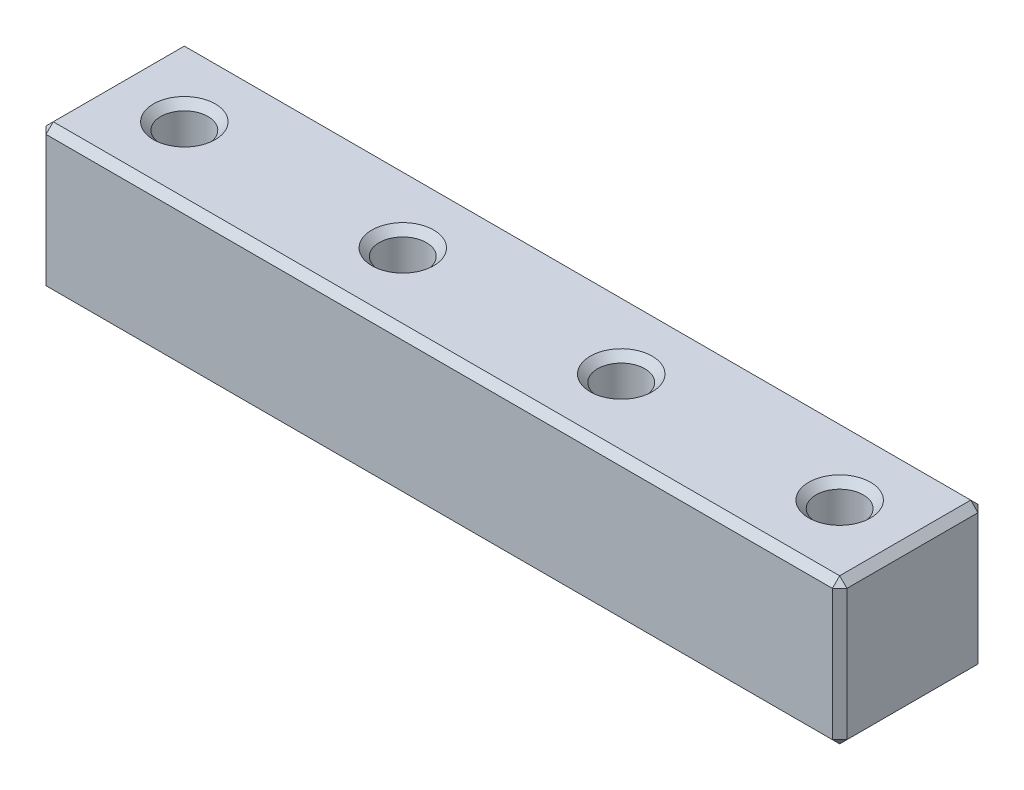
ISO-10303-21;
HEADER;
FILE_DESCRIPTION(('STEP AP214'),'2;1');
FILE_NAME('part.step','',(''),(''),'','','');
FILE_SCHEMA(('AUTOMOTIVE_DESIGN { 1 0 10303 214 1 1 1 1 }'));
ENDSEC;
DATA;
#1=APPLICATION_CONTEXT('core data for automotive mechanical design processes');
#2=APPLICATION_PROTOCOL_DEFINITION('international standard','automotive_design',2000,#1);
#3=PRODUCT_CONTEXT('',#1,'mechanical');
#4=PRODUCT('Part','Part','',(#3));
#5=PRODUCT_RELATED_PRODUCT_CATEGORY('part','',(#4));
#6=PRODUCT_DEFINITION_FORMATION('','',#4);
#7=PRODUCT_DEFINITION_CONTEXT('part definition',#1,'design');
#8=PRODUCT_DEFINITION('design','',#6,#7);
#9=PRODUCT_DEFINITION_SHAPE('','',#8);
#10=(LENGTH_UNIT() NAMED_UNIT(*) SI_UNIT(.MILLI.,.METRE.));
#11=(NAMED_UNIT(*) PLANE_ANGLE_UNIT() SI_UNIT($,.RADIAN.));
#12=(NAMED_UNIT(*) SI_UNIT($,.STERADIAN.) SOLID_ANGLE_UNIT());
#13=UNCERTAINTY_MEASURE_WITH_UNIT(LENGTH_MEASURE(1.E-05),#10,'distance_accuracy_value','');
#14=(GEOMETRIC_REPRESENTATION_CONTEXT(3) GLOBAL_UNCERTAINTY_ASSIGNED_CONTEXT((#13)) GLOBAL_UNIT_ASSIGNED_CONTEXT((#10,
#11,#12)) REPRESENTATION_CONTEXT('',''));
#15=CARTESIAN_POINT('',(0.,0.,0.));
#16=DIRECTION('',(0.,0.,1.));
#17=DIRECTION('',(1.,0.,0.));
#18=AXIS2_PLACEMENT_3D('',#15,#16,#17);
#19=CARTESIAN_POINT('',(0.,20.,0.));
#20=DIRECTION('',(0.,-1.,0.));
#21=DIRECTION('',(0.,0.,-1.));
#22=AXIS2_PLACEMENT_3D('',#19,#20,#21);
#23=PLANE('',#22);
#24=CARTESIAN_POINT('',(45.,20.,0.));
#25=DIRECTION('',(0.,-1.,0.));
#26=DIRECTION('',(0.,0.,-1.));
#27=AXIS2_PLACEMENT_3D('',#24,#25,#26);
#28=CIRCLE('',#27,4.25);
#29=CARTESIAN_POINT('',(45.,20.,-4.25000000000002));
#30=VERTEX_POINT('',#29);
#31=EDGE_CURVE('E206',#30,#30,#28,.T.);
#32=ORIENTED_EDGE('',*,*,#31,.T.);
#33=EDGE_LOOP('',(#32));
#34=FACE_BOUND('',#33,.T.);
#35=CARTESIAN_POINT('',(15.,20.,0.));
#36=DIRECTION('',(0.,-1.,0.));
#37=DIRECTION('',(0.,0.,-1.));
#38=AXIS2_PLACEMENT_3D('',#35,#36,#37);
#39=CIRCLE('',#38,4.25);
#40=CARTESIAN_POINT('',(15.,20.,-4.25000000000001));
#41=VERTEX_POINT('',#40);
#42=EDGE_CURVE('E203',#41,#41,#39,.T.);
#43=ORIENTED_EDGE('',*,*,#42,.T.);
#44=EDGE_LOOP('',(#43));
#45=FACE_BOUND('',#44,.T.);
#46=CARTESIAN_POINT('',(-15.,20.,0.));
#47=DIRECTION('',(0.,-1.,0.));
#48=DIRECTION('',(0.,0.,-1.));
#49=AXIS2_PLACEMENT_3D('',#46,#47,#48);
#50=CIRCLE('',#49,4.25);
#51=CARTESIAN_POINT('',(-15.,20.,-4.25));
#52=VERTEX_POINT('',#51);
#53=EDGE_CURVE('E200',#52,#52,#50,.T.);
#54=ORIENTED_EDGE('',*,*,#53,.T.);
#55=EDGE_LOOP('',(#54));
#56=FACE_BOUND('',#55,.T.);
#57=CARTESIAN_POINT('',(-45.,20.,0.));
#58=DIRECTION('',(0.,-1.,0.));
#59=DIRECTION('',(0.,0.,-1.));
#60=AXIS2_PLACEMENT_3D('',#57,#58,#59);
#61=CIRCLE('',#60,4.25);
#62=CARTESIAN_POINT('',(-45.,20.,-4.25));
#63=VERTEX_POINT('',#62);
#64=EDGE_CURVE('E197',#63,#63,#61,.T.);
#65=ORIENTED_EDGE('',*,*,#64,.T.);
#66=EDGE_LOOP('',(#65));
#67=FACE_BOUND('',#66,.T.);
#68=DIRECTION('',(1.,0.,0.));
#69=VECTOR('',#68,1.);
#70=CARTESIAN_POINT('',(0.,20.,9.));
#71=LINE('',#70,#69);
#72=CARTESIAN_POINT('',(-54.,20.,9.));
#73=VERTEX_POINT('',#72);
#74=CARTESIAN_POINT('',(54.,20.,9.));
#75=VERTEX_POINT('',#74);
#76=EDGE_CURVE('E188',#73,#75,#71,.T.);
#77=ORIENTED_EDGE('',*,*,#76,.T.);
#78=DIRECTION('',(0.,0.,-1.));
#79=VECTOR('',#78,1.);
#80=CARTESIAN_POINT('',(54.,20.,0.));
#81=LINE('',#80,#79);
#82=CARTESIAN_POINT('',(54.,20.,-9.));
#83=VERTEX_POINT('',#82);
#84=EDGE_CURVE('E194',#75,#83,#81,.T.);
#85=ORIENTED_EDGE('',*,*,#84,.T.);
#86=DIRECTION('',(-1.,0.,0.));
#87=VECTOR('',#86,1.);
#88=CARTESIAN_POINT('',(0.,20.,-9.));
#89=LINE('',#88,#87);
#90=CARTESIAN_POINT('',(-54.,20.,-9.));
#91=VERTEX_POINT('',#90);
#92=EDGE_CURVE('E192',#83,#91,#89,.T.);
#93=ORIENTED_EDGE('',*,*,#92,.T.);
#94=DIRECTION('',(0.,0.,1.));
#95=VECTOR('',#94,1.);
#96=CARTESIAN_POINT('',(-54.,20.,0.));
#97=LINE('',#96,#95);
#98=EDGE_CURVE('E190',#91,#73,#97,.T.);
#99=ORIENTED_EDGE('',*,*,#98,.T.);
#100=EDGE_LOOP('',(#77,#85,#93,#99));
#101=FACE_BOUND('',#100,.T.);
#102=ADVANCED_FACE('F43',(#34,#45,#56,#67,#101),#23,.F.);
#103=CARTESIAN_POINT('',(0.,0.,0.));
#104=DIRECTION('',(0.,-1.,0.));
#105=DIRECTION('',(0.,0.,-1.));
#106=AXIS2_PLACEMENT_3D('',#103,#104,#105);
#107=PLANE('',#106);
#108=CARTESIAN_POINT('',(45.,0.,0.));
#109=DIRECTION('',(0.,-1.,0.));
#110=DIRECTION('',(0.,0.,-1.));
#111=AXIS2_PLACEMENT_3D('',#108,#109,#110);
#112=CIRCLE('',#111,4.25);
#113=CARTESIAN_POINT('',(45.,0.,-4.25000000000002));
#114=VERTEX_POINT('',#113);
#115=EDGE_CURVE('E179',#114,#114,#112,.F.);
#116=ORIENTED_EDGE('',*,*,#115,.T.);
#117=EDGE_LOOP('',(#116));
#118=FACE_BOUND('',#117,.T.);
#119=CARTESIAN_POINT('',(15.,0.,0.));
#120=DIRECTION('',(0.,-1.,0.));
#121=DIRECTION('',(0.,0.,-1.));
#122=AXIS2_PLACEMENT_3D('',#119,#120,#121);
#123=CIRCLE('',#122,4.25);
#124=CARTESIAN_POINT('',(15.,0.,-4.25000000000001));
#125=VERTEX_POINT('',#124);
#126=EDGE_CURVE('E176',#125,#125,#123,.F.);
#127=ORIENTED_EDGE('',*,*,#126,.T.);
#128=EDGE_LOOP('',(#127));
#129=FACE_BOUND('',#128,.T.);
#130=CARTESIAN_POINT('',(-15.,0.,0.));
#131=DIRECTION('',(0.,-1.,0.));
#132=DIRECTION('',(0.,0.,-1.));
#133=AXIS2_PLACEMENT_3D('',#130,#131,#132);
#134=CIRCLE('',#133,4.25);
#135=CARTESIAN_POINT('',(-15.,0.,-4.25));
#136=VERTEX_POINT('',#135);
#137=EDGE_CURVE('E169',#136,#136,#134,.F.);
#138=ORIENTED_EDGE('',*,*,#137,.T.);
#139=EDGE_LOOP('',(#138));
#140=FACE_BOUND('',#139,.T.);
#141=CARTESIAN_POINT('',(-45.,0.,0.));
#142=DIRECTION('',(0.,-1.,0.));
#143=DIRECTION('',(0.,0.,-1.));
#144=AXIS2_PLACEMENT_3D('',#141,#142,#143);
#145=CIRCLE('',#144,4.25);
#146=CARTESIAN_POINT('',(-45.,0.,-4.25));
#147=VERTEX_POINT('',#146);
#148=EDGE_CURVE('E166',#147,#147,#145,.F.);
#149=ORIENTED_EDGE('',*,*,#148,.T.);
#150=EDGE_LOOP('',(#149));
#151=FACE_BOUND('',#150,.T.);
#152=DIRECTION('',(1.,0.,0.));
#153=VECTOR('',#152,1.);
#154=CARTESIAN_POINT('',(55.,0.,-9.));
#155=LINE('',#154,#153);
#156=CARTESIAN_POINT('',(-54.,0.,-9.));
#157=VERTEX_POINT('',#156);
#158=CARTESIAN_POINT('',(54.,0.,-9.));
#159=VERTEX_POINT('',#158);
#160=EDGE_CURVE('E165',#157,#159,#155,.T.);
#161=ORIENTED_EDGE('',*,*,#160,.T.);
#162=DIRECTION('',(0.,0.,1.));
#163=VECTOR('',#162,1.);
#164=CARTESIAN_POINT('',(54.,0.,10.));
#165=LINE('',#164,#163);
#166=CARTESIAN_POINT('',(54.,0.,9.));
#167=VERTEX_POINT('',#166);
#168=EDGE_CURVE('E149',#159,#167,#165,.T.);
#169=ORIENTED_EDGE('',*,*,#168,.T.);
#170=DIRECTION('',(-1.,0.,0.));
#171=VECTOR('',#170,1.);
#172=CARTESIAN_POINT('',(-55.,0.,9.));
#173=LINE('',#172,#171);
#174=CARTESIAN_POINT('',(-54.,0.,9.));
#175=VERTEX_POINT('',#174);
#176=EDGE_CURVE('E155',#167,#175,#173,.T.);
#177=ORIENTED_EDGE('',*,*,#176,.T.);
#178=DIRECTION('',(0.,0.,-1.));
#179=VECTOR('',#178,1.);
#180=CARTESIAN_POINT('',(-54.,0.,-10.));
#181=LINE('',#180,#179);
#182=EDGE_CURVE('E161',#175,#157,#181,.T.);
#183=ORIENTED_EDGE('',*,*,#182,.T.);
#184=EDGE_LOOP('',(#161,#169,#177,#183));
#185=FACE_BOUND('',#184,.T.);
#186=ADVANCED_FACE('F163',(#118,#129,#140,#151,#185),#107,.T.);
#187=CARTESIAN_POINT('',(55.,20.,10.));
#188=DIRECTION('',(-1.,0.,0.));
#189=DIRECTION('',(0.,0.,1.));
#190=AXIS2_PLACEMENT_3D('',#187,#188,#189);
#191=PLANE('',#190);
#192=DIRECTION('',(0.,0.,-1.));
#193=VECTOR('',#192,1.);
#194=CARTESIAN_POINT('',(55.,1.,-10.));
#195=LINE('',#194,#193);
#196=CARTESIAN_POINT('',(55.,1.,9.));
#197=VERTEX_POINT('',#196);
#198=CARTESIAN_POINT('',(55.,1.,-9.));
#199=VERTEX_POINT('',#198);
#200=EDGE_CURVE('E151',#197,#199,#195,.T.);
#201=ORIENTED_EDGE('',*,*,#200,.T.);
#202=DIRECTION('',(0.,1.,0.));
#203=VECTOR('',#202,1.);
#204=CARTESIAN_POINT('',(55.,20.,-9.));
#205=LINE('',#204,#203);
#206=CARTESIAN_POINT('',(55.,19.,-9.));
#207=VERTEX_POINT('',#206);
#208=EDGE_CURVE('E233',#199,#207,#205,.T.);
#209=ORIENTED_EDGE('',*,*,#208,.T.);
#210=DIRECTION('',(0.,0.,1.));
#211=VECTOR('',#210,1.);
#212=CARTESIAN_POINT('',(55.,19.,10.));
#213=LINE('',#212,#211);
#214=CARTESIAN_POINT('',(55.,19.,9.));
#215=VERTEX_POINT('',#214);
#216=EDGE_CURVE('E230',#207,#215,#213,.T.);
#217=ORIENTED_EDGE('',*,*,#216,.T.);
#218=DIRECTION('',(0.,-1.,0.));
#219=VECTOR('',#218,1.);
#220=CARTESIAN_POINT('',(55.,20.,9.));
#221=LINE('',#220,#219);
#222=EDGE_CURVE('E227',#215,#197,#221,.T.);
#223=ORIENTED_EDGE('',*,*,#222,.T.);
#224=EDGE_LOOP('',(#201,#209,#217,#223));
#225=FACE_BOUND('',#224,.T.);
#226=ADVANCED_FACE('F335',(#225),#191,.F.);
#227=CARTESIAN_POINT('',(-55.,20.,-10.));
#228=DIRECTION('',(0.,0.,1.));
#229=DIRECTION('',(1.,0.,0.));
#230=AXIS2_PLACEMENT_3D('',#227,#228,#229);
#231=PLANE('',#230);
#232=DIRECTION('',(1.,0.,0.));
#233=VECTOR('',#232,1.);
#234=CARTESIAN_POINT('',(-55.,19.,-10.));
#235=LINE('',#234,#233);
#236=CARTESIAN_POINT('',(-54.,19.,-10.));
#237=VERTEX_POINT('',#236);
#238=CARTESIAN_POINT('',(54.,19.,-10.));
#239=VERTEX_POINT('',#238);
#240=EDGE_CURVE('E239',#237,#239,#235,.T.);
#241=ORIENTED_EDGE('',*,*,#240,.T.);
#242=DIRECTION('',(0.,-1.,0.));
#243=VECTOR('',#242,1.);
#244=CARTESIAN_POINT('',(54.,20.,-10.));
#245=LINE('',#244,#243);
#246=CARTESIAN_POINT('',(54.,1.,-10.));
#247=VERTEX_POINT('',#246);
#248=EDGE_CURVE('E241',#239,#247,#245,.T.);
#249=ORIENTED_EDGE('',*,*,#248,.T.);
#250=DIRECTION('',(-1.,0.,0.));
#251=VECTOR('',#250,1.);
#252=CARTESIAN_POINT('',(-55.,1.,-10.));
#253=LINE('',#252,#251);
#254=CARTESIAN_POINT('',(-54.,1.,-10.));
#255=VERTEX_POINT('',#254);
#256=EDGE_CURVE('E237',#247,#255,#253,.T.);
#257=ORIENTED_EDGE('',*,*,#256,.T.);
#258=DIRECTION('',(0.,1.,0.));
#259=VECTOR('',#258,1.);
#260=CARTESIAN_POINT('',(-54.,20.,-10.));
#261=LINE('',#260,#259);
#262=EDGE_CURVE('E235',#255,#237,#261,.T.);
#263=ORIENTED_EDGE('',*,*,#262,.T.);
#264=EDGE_LOOP('',(#241,#249,#257,#263));
#265=FACE_BOUND('',#264,.T.);
#266=ADVANCED_FACE('F367',(#265),#231,.F.);
#267=CARTESIAN_POINT('',(-55.,20.,10.));
#268=DIRECTION('',(1.,0.,0.));
#269=DIRECTION('',(0.,0.,-1.));
#270=AXIS2_PLACEMENT_3D('',#267,#268,#269);
#271=PLANE('',#270);
#272=DIRECTION('',(0.,0.,-1.));
#273=VECTOR('',#272,1.);
#274=CARTESIAN_POINT('',(-55.,19.,10.));
#275=LINE('',#274,#273);
#276=CARTESIAN_POINT('',(-55.,19.,9.));
#277=VERTEX_POINT('',#276);
#278=CARTESIAN_POINT('',(-55.,19.,-9.));
#279=VERTEX_POINT('',#278);
#280=EDGE_CURVE('E248',#277,#279,#275,.T.);
#281=ORIENTED_EDGE('',*,*,#280,.T.);
#282=DIRECTION('',(0.,-1.,0.));
#283=VECTOR('',#282,1.);
#284=CARTESIAN_POINT('',(-55.,20.,-9.));
#285=LINE('',#284,#283);
#286=CARTESIAN_POINT('',(-55.,1.,-9.));
#287=VERTEX_POINT('',#286);
#288=EDGE_CURVE('E250',#279,#287,#285,.T.);
#289=ORIENTED_EDGE('',*,*,#288,.T.);
#290=DIRECTION('',(0.,0.,1.));
#291=VECTOR('',#290,1.);
#292=CARTESIAN_POINT('',(-55.,1.,10.));
#293=LINE('',#292,#291);
#294=CARTESIAN_POINT('',(-55.,1.,9.));
#295=VERTEX_POINT('',#294);
#296=EDGE_CURVE('E246',#287,#295,#293,.T.);
#297=ORIENTED_EDGE('',*,*,#296,.T.);
#298=DIRECTION('',(0.,1.,0.));
#299=VECTOR('',#298,1.);
#300=CARTESIAN_POINT('',(-55.,20.,9.));
#301=LINE('',#300,#299);
#302=EDGE_CURVE('E244',#295,#277,#301,.T.);
#303=ORIENTED_EDGE('',*,*,#302,.T.);
#304=EDGE_LOOP('',(#281,#289,#297,#303));
#305=FACE_BOUND('',#304,.T.);
#306=ADVANCED_FACE('F358',(#305),#271,.F.);
#307=CARTESIAN_POINT('',(-55.,20.,10.));
#308=DIRECTION('',(0.,0.,-1.));
#309=DIRECTION('',(-1.,0.,0.));
#310=AXIS2_PLACEMENT_3D('',#307,#308,#309);
#311=PLANE('',#310);
#312=DIRECTION('',(-1.,0.,0.));
#313=VECTOR('',#312,1.);
#314=CARTESIAN_POINT('',(-55.,19.,10.));
#315=LINE('',#314,#313);
#316=CARTESIAN_POINT('',(54.,19.,10.));
#317=VERTEX_POINT('',#316);
#318=CARTESIAN_POINT('',(-54.,19.,10.));
#319=VERTEX_POINT('',#318);
#320=EDGE_CURVE('E53',#317,#319,#315,.T.);
#321=ORIENTED_EDGE('',*,*,#320,.T.);
#322=DIRECTION('',(0.,-1.,0.));
#323=VECTOR('',#322,1.);
#324=CARTESIAN_POINT('',(-54.,20.,10.));
#325=LINE('',#324,#323);
#326=CARTESIAN_POINT('',(-54.,1.,10.));
#327=VERTEX_POINT('',#326);
#328=EDGE_CURVE('E11',#319,#327,#325,.T.);
#329=ORIENTED_EDGE('',*,*,#328,.T.);
#330=DIRECTION('',(1.,0.,0.));
#331=VECTOR('',#330,1.);
#332=CARTESIAN_POINT('',(55.,1.,10.));
#333=LINE('',#332,#331);
#334=CARTESIAN_POINT('',(54.,1.,10.));
#335=VERTEX_POINT('',#334);
#336=EDGE_CURVE('E253',#327,#335,#333,.T.);
#337=ORIENTED_EDGE('',*,*,#336,.T.);
#338=DIRECTION('',(0.,1.,0.));
#339=VECTOR('',#338,1.);
#340=CARTESIAN_POINT('',(54.,20.,10.));
#341=LINE('',#340,#339);
#342=EDGE_CURVE('E64',#335,#317,#341,.T.);
#343=ORIENTED_EDGE('',*,*,#342,.T.);
#344=EDGE_LOOP('',(#321,#329,#337,#343));
#345=FACE_BOUND('',#344,.T.);
#346=ADVANCED_FACE('F355',(#345),#311,.F.);
#347=CARTESIAN_POINT('',(-45.,20.,0.));
#348=DIRECTION('',(0.,-1.,0.));
#349=DIRECTION('',(0.,0.,-1.));
#350=AXIS2_PLACEMENT_3D('',#347,#348,#349);
#351=CYLINDRICAL_SURFACE('',#350,3.25);
#352=CARTESIAN_POINT('',(-45.,1.,0.));
#353=DIRECTION('',(0.,-1.,0.));
#354=DIRECTION('',(0.,0.,-1.));
#355=AXIS2_PLACEMENT_3D('',#352,#353,#354);
#356=CIRCLE('',#355,3.25);
#357=CARTESIAN_POINT('',(-45.,1.,-3.25));
#358=VERTEX_POINT('',#357);
#359=EDGE_CURVE('E224',#358,#358,#356,.T.);
#360=ORIENTED_EDGE('',*,*,#359,.T.);
#361=EDGE_LOOP('',(#360));
#362=FACE_BOUND('',#361,.T.);
#363=CARTESIAN_POINT('',(-45.,19.,0.));
#364=DIRECTION('',(0.,-1.,0.));
#365=DIRECTION('',(0.,0.,-1.));
#366=AXIS2_PLACEMENT_3D('',#363,#364,#365);
#367=CIRCLE('',#366,3.25);
#368=CARTESIAN_POINT('',(-45.,19.,-3.25));
#369=VERTEX_POINT('',#368);
#370=EDGE_CURVE('E221',#369,#369,#367,.F.);
#371=ORIENTED_EDGE('',*,*,#370,.T.);
#372=EDGE_LOOP('',(#371));
#373=FACE_BOUND('',#372,.T.);
#374=ADVANCED_FACE('F357',(#362,#373),#351,.F.);
#375=CARTESIAN_POINT('',(-15.,20.,0.));
#376=DIRECTION('',(0.,-1.,0.));
#377=DIRECTION('',(0.,0.,-1.));
#378=AXIS2_PLACEMENT_3D('',#375,#376,#377);
#379=CYLINDRICAL_SURFACE('',#378,3.25);
#380=CARTESIAN_POINT('',(-15.,1.,0.));
#381=DIRECTION('',(0.,-1.,0.));
#382=DIRECTION('',(0.,0.,-1.));
#383=AXIS2_PLACEMENT_3D('',#380,#381,#382);
#384=CIRCLE('',#383,3.25);
#385=CARTESIAN_POINT('',(-15.,1.,-3.25));
#386=VERTEX_POINT('',#385);
#387=EDGE_CURVE('E218',#386,#386,#384,.T.);
#388=ORIENTED_EDGE('',*,*,#387,.T.);
#389=EDGE_LOOP('',(#388));
#390=FACE_BOUND('',#389,.T.);
#391=CARTESIAN_POINT('',(-15.,19.,0.));
#392=DIRECTION('',(0.,-1.,0.));
#393=DIRECTION('',(0.,0.,-1.));
#394=AXIS2_PLACEMENT_3D('',#391,#392,#393);
#395=CIRCLE('',#394,3.25);
#396=CARTESIAN_POINT('',(-15.,19.,-3.25));
#397=VERTEX_POINT('',#396);
#398=EDGE_CURVE('E215',#397,#397,#395,.F.);
#399=ORIENTED_EDGE('',*,*,#398,.T.);
#400=EDGE_LOOP('',(#399));
#401=FACE_BOUND('',#400,.T.);
#402=ADVANCED_FACE('F364',(#390,#401),#379,.F.);
#403=CARTESIAN_POINT('',(15.,20.,0.));
#404=DIRECTION('',(0.,-1.,0.));
#405=DIRECTION('',(0.,0.,-1.));
#406=AXIS2_PLACEMENT_3D('',#403,#404,#405);
#407=CYLINDRICAL_SURFACE('',#406,3.25);
#408=CARTESIAN_POINT('',(15.,1.,0.));
#409=DIRECTION('',(0.,-1.,0.));
#410=DIRECTION('',(0.,0.,-1.));
#411=AXIS2_PLACEMENT_3D('',#408,#409,#410);
#412=CIRCLE('',#411,3.25);
#413=CARTESIAN_POINT('',(15.,1.,-3.25));
#414=VERTEX_POINT('',#413);
#415=EDGE_CURVE('E212',#414,#414,#412,.T.);
#416=ORIENTED_EDGE('',*,*,#415,.T.);
#417=EDGE_LOOP('',(#416));
#418=FACE_BOUND('',#417,.T.);
#419=CARTESIAN_POINT('',(15.,19.,0.));
#420=DIRECTION('',(0.,-1.,0.));
#421=DIRECTION('',(0.,0.,-1.));
#422=AXIS2_PLACEMENT_3D('',#419,#420,#421);
#423=CIRCLE('',#422,3.25);
#424=CARTESIAN_POINT('',(15.,19.,-3.25));
#425=VERTEX_POINT('',#424);
#426=EDGE_CURVE('E209',#425,#425,#423,.F.);
#427=ORIENTED_EDGE('',*,*,#426,.T.);
#428=EDGE_LOOP('',(#427));
#429=FACE_BOUND('',#428,.T.);
#430=ADVANCED_FACE('F382',(#418,#429),#407,.F.);
#431=CARTESIAN_POINT('',(45.,20.,0.));
#432=DIRECTION('',(0.,-1.,0.));
#433=DIRECTION('',(0.,0.,-1.));
#434=AXIS2_PLACEMENT_3D('',#431,#432,#433);
#435=CYLINDRICAL_SURFACE('',#434,3.25);
#436=CARTESIAN_POINT('',(45.,1.,0.));
#437=DIRECTION('',(0.,-1.,0.));
#438=DIRECTION('',(0.,0.,-1.));
#439=AXIS2_PLACEMENT_3D('',#436,#437,#438);
#440=CIRCLE('',#439,3.25);
#441=CARTESIAN_POINT('',(45.,1.,-3.25000000000001));
#442=VERTEX_POINT('',#441);
#443=EDGE_CURVE('E185',#442,#442,#440,.T.);
#444=ORIENTED_EDGE('',*,*,#443,.T.);
#445=EDGE_LOOP('',(#444));
#446=FACE_BOUND('',#445,.T.);
#447=CARTESIAN_POINT('',(45.,19.,0.));
#448=DIRECTION('',(0.,-1.,0.));
#449=DIRECTION('',(0.,0.,-1.));
#450=AXIS2_PLACEMENT_3D('',#447,#448,#449);
#451=CIRCLE('',#450,3.25);
#452=CARTESIAN_POINT('',(45.,19.,-3.25000000000001));
#453=VERTEX_POINT('',#452);
#454=EDGE_CURVE('E182',#453,#453,#451,.F.);
#455=ORIENTED_EDGE('',*,*,#454,.T.);
#456=EDGE_LOOP('',(#455));
#457=FACE_BOUND('',#456,.T.);
#458=ADVANCED_FACE('F386',(#446,#457),#435,.F.);
#459=CARTESIAN_POINT('',(45.,0.,0.));
#460=DIRECTION('',(0.,-1.,0.));
#461=DIRECTION('',(0.,0.,-1.));
#462=AXIS2_PLACEMENT_3D('',#459,#460,#461);
#463=CONICAL_SURFACE('',#462,4.25,0.785398163397448);
#464=ORIENTED_EDGE('',*,*,#443,.F.);
#465=EDGE_LOOP('',(#464));
#466=FACE_BOUND('',#465,.T.);
#467=ORIENTED_EDGE('',*,*,#115,.F.);
#468=EDGE_LOOP('',(#467));
#469=FACE_BOUND('',#468,.T.);
#470=ADVANCED_FACE('F389',(#466,#469),#463,.F.);
#471=CARTESIAN_POINT('',(45.,19.,0.));
#472=DIRECTION('',(0.,1.,0.));
#473=DIRECTION('',(0.,0.,1.));
#474=AXIS2_PLACEMENT_3D('',#471,#472,#473);
#475=CONICAL_SURFACE('',#474,3.25,0.785398163397449);
#476=ORIENTED_EDGE('',*,*,#31,.F.);
#477=EDGE_LOOP('',(#476));
#478=FACE_BOUND('',#477,.T.);
#479=ORIENTED_EDGE('',*,*,#454,.F.);
#480=EDGE_LOOP('',(#479));
#481=FACE_BOUND('',#480,.T.);
#482=ADVANCED_FACE('F394',(#478,#481),#475,.F.);
#483=CARTESIAN_POINT('',(15.,0.,0.));
#484=DIRECTION('',(0.,-1.,0.));
#485=DIRECTION('',(0.,0.,-1.));
#486=AXIS2_PLACEMENT_3D('',#483,#484,#485);
#487=CONICAL_SURFACE('',#486,4.25,0.785398163397448);
#488=ORIENTED_EDGE('',*,*,#415,.F.);
#489=EDGE_LOOP('',(#488));
#490=FACE_BOUND('',#489,.T.);
#491=ORIENTED_EDGE('',*,*,#126,.F.);
#492=EDGE_LOOP('',(#491));
#493=FACE_BOUND('',#492,.T.);
#494=ADVANCED_FACE('F402',(#490,#493),#487,.F.);
#495=CARTESIAN_POINT('',(15.,19.,0.));
#496=DIRECTION('',(0.,1.,0.));
#497=DIRECTION('',(0.,0.,1.));
#498=AXIS2_PLACEMENT_3D('',#495,#496,#497);
#499=CONICAL_SURFACE('',#498,3.25,0.78539816339745);
#500=ORIENTED_EDGE('',*,*,#42,.F.);
#501=EDGE_LOOP('',(#500));
#502=FACE_BOUND('',#501,.T.);
#503=ORIENTED_EDGE('',*,*,#426,.F.);
#504=EDGE_LOOP('',(#503));
#505=FACE_BOUND('',#504,.T.);
#506=ADVANCED_FACE('F408',(#502,#505),#499,.F.);
#507=CARTESIAN_POINT('',(-15.,0.,0.));
#508=DIRECTION('',(0.,-1.,0.));
#509=DIRECTION('',(0.,0.,-1.));
#510=AXIS2_PLACEMENT_3D('',#507,#508,#509);
#511=CONICAL_SURFACE('',#510,4.25,0.785398163397448);
#512=ORIENTED_EDGE('',*,*,#387,.F.);
#513=EDGE_LOOP('',(#512));
#514=FACE_BOUND('',#513,.T.);
#515=ORIENTED_EDGE('',*,*,#137,.F.);
#516=EDGE_LOOP('',(#515));
#517=FACE_BOUND('',#516,.T.);
#518=ADVANCED_FACE('F427',(#514,#517),#511,.F.);
#519=CARTESIAN_POINT('',(-15.,19.,0.));
#520=DIRECTION('',(0.,1.,0.));
#521=DIRECTION('',(0.,0.,1.));
#522=AXIS2_PLACEMENT_3D('',#519,#520,#521);
#523=CONICAL_SURFACE('',#522,3.25,0.78539816339745);
#524=ORIENTED_EDGE('',*,*,#53,.F.);
#525=EDGE_LOOP('',(#524));
#526=FACE_BOUND('',#525,.T.);
#527=ORIENTED_EDGE('',*,*,#398,.F.);
#528=EDGE_LOOP('',(#527));
#529=FACE_BOUND('',#528,.T.);
#530=ADVANCED_FACE('F434',(#526,#529),#523,.F.);
#531=CARTESIAN_POINT('',(-45.,0.,0.));
#532=DIRECTION('',(0.,-1.,0.));
#533=DIRECTION('',(0.,0.,-1.));
#534=AXIS2_PLACEMENT_3D('',#531,#532,#533);
#535=CONICAL_SURFACE('',#534,4.25,0.785398163397448);
#536=ORIENTED_EDGE('',*,*,#359,.F.);
#537=EDGE_LOOP('',(#536));
#538=FACE_BOUND('',#537,.T.);
#539=ORIENTED_EDGE('',*,*,#148,.F.);
#540=EDGE_LOOP('',(#539));
#541=FACE_BOUND('',#540,.T.);
#542=ADVANCED_FACE('F441',(#538,#541),#535,.F.);
#543=CARTESIAN_POINT('',(-45.,19.,0.));
#544=DIRECTION('',(0.,1.,0.));
#545=DIRECTION('',(0.,0.,1.));
#546=AXIS2_PLACEMENT_3D('',#543,#544,#545);
#547=CONICAL_SURFACE('',#546,3.25,0.785398163397449);
#548=ORIENTED_EDGE('',*,*,#64,.F.);
#549=EDGE_LOOP('',(#548));
#550=FACE_BOUND('',#549,.T.);
#551=ORIENTED_EDGE('',*,*,#370,.F.);
#552=EDGE_LOOP('',(#551));
#553=FACE_BOUND('',#552,.T.);
#554=ADVANCED_FACE('F448',(#550,#553),#547,.F.);
#555=CARTESIAN_POINT('',(-55.,1.,10.));
#556=DIRECTION('',(-0.707106781186547,-0.707106781186547,0.));
#557=DIRECTION('',(0.,0.,-1.));
#558=AXIS2_PLACEMENT_3D('',#555,#556,#557);
#559=PLANE('',#558);
#560=DIRECTION('',(0.707106781186547,-0.707106781186547,0.));
#561=VECTOR('',#560,1.);
#562=CARTESIAN_POINT('',(-55.,1.,9.));
#563=LINE('',#562,#561);
#564=EDGE_CURVE('E48',#295,#175,#563,.T.);
#565=ORIENTED_EDGE('',*,*,#564,.F.);
#566=ORIENTED_EDGE('',*,*,#296,.F.);
#567=DIRECTION('',(-0.707106781186547,0.707106781186547,0.));
#568=VECTOR('',#567,1.);
#569=CARTESIAN_POINT('',(-54.5,0.5,-9.));
#570=LINE('',#569,#568);
#571=EDGE_CURVE('E306',#157,#287,#570,.T.);
#572=ORIENTED_EDGE('',*,*,#571,.F.);
#573=ORIENTED_EDGE('',*,*,#182,.F.);
#574=EDGE_LOOP('',(#565,#566,#572,#573));
#575=FACE_BOUND('',#574,.T.);
#576=ADVANCED_FACE('F46',(#575),#559,.T.);
#577=CARTESIAN_POINT('',(-55.,1.,9.));
#578=DIRECTION('',(-0.577350269189625,-0.577350269189626,0.577350269189625));
#579=DIRECTION('',(0.,-0.707106781186547,-0.707106781186548));
#580=AXIS2_PLACEMENT_3D('',#577,#578,#579);
#581=PLANE('',#580);
#582=DIRECTION('',(0.707106781186548,0.,0.707106781186548));
#583=VECTOR('',#582,1.);
#584=CARTESIAN_POINT('',(-55.,1.,9.));
#585=LINE('',#584,#583);
#586=EDGE_CURVE('E303',#295,#327,#585,.T.);
#587=ORIENTED_EDGE('',*,*,#586,.F.);
#588=ORIENTED_EDGE('',*,*,#564,.T.);
#589=DIRECTION('',(0.,0.707106781186547,0.707106781186548));
#590=VECTOR('',#589,1.);
#591=CARTESIAN_POINT('',(-54.,0.500000000000001,9.5));
#592=LINE('',#591,#590);
#593=EDGE_CURVE('E158',#327,#175,#592,.F.);
#594=ORIENTED_EDGE('',*,*,#593,.F.);
#595=EDGE_LOOP('',(#587,#588,#594));
#596=FACE_BOUND('',#595,.T.);
#597=ADVANCED_FACE('F317',(#596),#581,.T.);
#598=CARTESIAN_POINT('',(-54.,1.,-10.));
#599=DIRECTION('',(-0.577350269189626,-0.577350269189626,-0.577350269189626));
#600=DIRECTION('',(-0.707106781186547,0.,0.707106781186547));
#601=AXIS2_PLACEMENT_3D('',#598,#599,#600);
#602=PLANE('',#601);
#603=DIRECTION('',(0.,-0.707106781186547,0.707106781186547));
#604=VECTOR('',#603,1.);
#605=CARTESIAN_POINT('',(-54.,1.,-10.));
#606=LINE('',#605,#604);
#607=EDGE_CURVE('E152',#157,#255,#606,.F.);
#608=ORIENTED_EDGE('',*,*,#607,.F.);
#609=ORIENTED_EDGE('',*,*,#571,.T.);
#610=DIRECTION('',(-0.707106781186547,0.,0.707106781186547));
#611=VECTOR('',#610,1.);
#612=CARTESIAN_POINT('',(-54.,1.,-10.));
#613=LINE('',#612,#611);
#614=EDGE_CURVE('E301',#255,#287,#613,.T.);
#615=ORIENTED_EDGE('',*,*,#614,.F.);
#616=EDGE_LOOP('',(#608,#609,#615));
#617=FACE_BOUND('',#616,.T.);
#618=ADVANCED_FACE('F320',(#617),#602,.T.);
#619=CARTESIAN_POINT('',(-55.,1.,10.));
#620=DIRECTION('',(0.,-0.707106781186548,0.707106781186547));
#621=DIRECTION('',(-1.,0.,0.));
#622=AXIS2_PLACEMENT_3D('',#619,#620,#621);
#623=PLANE('',#622);
#624=ORIENTED_EDGE('',*,*,#593,.T.);
#625=ORIENTED_EDGE('',*,*,#176,.F.);
#626=DIRECTION('',(0.,-0.707106781186547,-0.707106781186548));
#627=VECTOR('',#626,1.);
#628=CARTESIAN_POINT('',(54.,0.,9.));
#629=LINE('',#628,#627);
#630=EDGE_CURVE('E133',#335,#167,#629,.T.);
#631=ORIENTED_EDGE('',*,*,#630,.F.);
#632=ORIENTED_EDGE('',*,*,#336,.F.);
#633=EDGE_LOOP('',(#624,#625,#631,#632));
#634=FACE_BOUND('',#633,.T.);
#635=ADVANCED_FACE('F156',(#634),#623,.T.);
#636=CARTESIAN_POINT('',(-54.,20.,10.));
#637=DIRECTION('',(0.707106781186547,0.,-0.707106781186547));
#638=DIRECTION('',(0.,-1.,0.));
#639=AXIS2_PLACEMENT_3D('',#636,#637,#638);
#640=PLANE('',#639);
#641=ORIENTED_EDGE('',*,*,#586,.T.);
#642=ORIENTED_EDGE('',*,*,#328,.F.);
#643=DIRECTION('',(-0.707106781186548,0.,-0.707106781186548));
#644=VECTOR('',#643,1.);
#645=CARTESIAN_POINT('',(-54.5,19.,9.5));
#646=LINE('',#645,#644);
#647=EDGE_CURVE('E141',#277,#319,#646,.F.);
#648=ORIENTED_EDGE('',*,*,#647,.F.);
#649=ORIENTED_EDGE('',*,*,#302,.F.);
#650=EDGE_LOOP('',(#641,#642,#648,#649));
#651=FACE_BOUND('',#650,.T.);
#652=ADVANCED_FACE('F354',(#651),#640,.F.);
#653=CARTESIAN_POINT('',(-54.,20.,0.));
#654=DIRECTION('',(0.707106781186547,-0.707106781186547,0.));
#655=DIRECTION('',(0.,0.,1.));
#656=AXIS2_PLACEMENT_3D('',#653,#654,#655);
#657=PLANE('',#656);
#658=DIRECTION('',(-0.707106781186547,-0.707106781186547,0.));
#659=VECTOR('',#658,1.);
#660=CARTESIAN_POINT('',(-54.,20.,-9.));
#661=LINE('',#660,#659);
#662=EDGE_CURVE('E291',#279,#91,#661,.F.);
#663=ORIENTED_EDGE('',*,*,#662,.F.);
#664=ORIENTED_EDGE('',*,*,#280,.F.);
#665=DIRECTION('',(0.707106781186547,0.707106781186547,0.));
#666=VECTOR('',#665,1.);
#667=CARTESIAN_POINT('',(-54.,20.,9.));
#668=LINE('',#667,#666);
#669=EDGE_CURVE('E294',#73,#277,#668,.F.);
#670=ORIENTED_EDGE('',*,*,#669,.F.);
#671=ORIENTED_EDGE('',*,*,#98,.F.);
#672=EDGE_LOOP('',(#663,#664,#670,#671));
#673=FACE_BOUND('',#672,.T.);
#674=ADVANCED_FACE('F535',(#673),#657,.F.);
#675=CARTESIAN_POINT('',(-55.,20.,-9.));
#676=DIRECTION('',(0.707106781186547,0.,0.707106781186547));
#677=DIRECTION('',(0.,-1.,0.));
#678=AXIS2_PLACEMENT_3D('',#675,#676,#677);
#679=PLANE('',#678);
#680=ORIENTED_EDGE('',*,*,#614,.T.);
#681=ORIENTED_EDGE('',*,*,#288,.F.);
#682=DIRECTION('',(0.707106781186547,0.,-0.707106781186547));
#683=VECTOR('',#682,1.);
#684=CARTESIAN_POINT('',(-54.5,19.,-9.5));
#685=LINE('',#684,#683);
#686=EDGE_CURVE('E288',#237,#279,#685,.F.);
#687=ORIENTED_EDGE('',*,*,#686,.F.);
#688=ORIENTED_EDGE('',*,*,#262,.F.);
#689=EDGE_LOOP('',(#680,#681,#687,#688));
#690=FACE_BOUND('',#689,.T.);
#691=ADVANCED_FACE('F529',(#690),#679,.F.);
#692=CARTESIAN_POINT('',(-55.,1.,-10.));
#693=DIRECTION('',(0.,-0.707106781186547,-0.707106781186547));
#694=DIRECTION('',(1.,0.,0.));
#695=AXIS2_PLACEMENT_3D('',#692,#693,#694);
#696=PLANE('',#695);
#697=ORIENTED_EDGE('',*,*,#607,.T.);
#698=ORIENTED_EDGE('',*,*,#256,.F.);
#699=DIRECTION('',(0.,0.707106781186548,-0.707106781186548));
#700=VECTOR('',#699,1.);
#701=CARTESIAN_POINT('',(54.,0.500000000000001,-9.5));
#702=LINE('',#701,#700);
#703=EDGE_CURVE('E285',#159,#247,#702,.T.);
#704=ORIENTED_EDGE('',*,*,#703,.F.);
#705=ORIENTED_EDGE('',*,*,#160,.F.);
#706=EDGE_LOOP('',(#697,#698,#704,#705));
#707=FACE_BOUND('',#706,.T.);
#708=ADVANCED_FACE('F324',(#707),#696,.T.);
#709=CARTESIAN_POINT('',(55.,1.,10.));
#710=DIRECTION('',(0.707106781186547,-0.707106781186547,0.));
#711=DIRECTION('',(0.,0.,1.));
#712=AXIS2_PLACEMENT_3D('',#709,#710,#711);
#713=PLANE('',#712);
#714=DIRECTION('',(0.707106781186547,0.707106781186547,0.));
#715=VECTOR('',#714,1.);
#716=CARTESIAN_POINT('',(54.,0.,9.));
#717=LINE('',#716,#715);
#718=EDGE_CURVE('E136',#167,#197,#717,.T.);
#719=ORIENTED_EDGE('',*,*,#718,.F.);
#720=ORIENTED_EDGE('',*,*,#168,.F.);
#721=DIRECTION('',(-0.707106781186547,-0.707106781186547,0.));
#722=VECTOR('',#721,1.);
#723=CARTESIAN_POINT('',(55.,1.,-9.));
#724=LINE('',#723,#722);
#725=EDGE_CURVE('E282',#199,#159,#724,.T.);
#726=ORIENTED_EDGE('',*,*,#725,.F.);
#727=ORIENTED_EDGE('',*,*,#200,.F.);
#728=EDGE_LOOP('',(#719,#720,#726,#727));
#729=FACE_BOUND('',#728,.T.);
#730=ADVANCED_FACE('F146',(#729),#713,.T.);
#731=CARTESIAN_POINT('',(54.,0.,9.));
#732=DIRECTION('',(0.577350269189625,-0.577350269189626,0.577350269189625));
#733=DIRECTION('',(0.,-0.707106781186547,-0.707106781186548));
#734=AXIS2_PLACEMENT_3D('',#731,#732,#733);
#735=PLANE('',#734);
#736=ORIENTED_EDGE('',*,*,#630,.T.);
#737=ORIENTED_EDGE('',*,*,#718,.T.);
#738=DIRECTION('',(0.707106781186548,0.,-0.707106781186548));
#739=VECTOR('',#738,1.);
#740=CARTESIAN_POINT('',(54.5,1.,9.5));
#741=LINE('',#740,#739);
#742=EDGE_CURVE('E138',#335,#197,#741,.T.);
#743=ORIENTED_EDGE('',*,*,#742,.F.);
#744=EDGE_LOOP('',(#736,#737,#743));
#745=FACE_BOUND('',#744,.T.);
#746=ADVANCED_FACE('F135',(#745),#735,.T.);
#747=CARTESIAN_POINT('',(-54.,20.,9.));
#748=DIRECTION('',(-0.577350269189625,0.577350269189626,0.577350269189625));
#749=DIRECTION('',(0.,-0.707106781186547,0.707106781186548));
#750=AXIS2_PLACEMENT_3D('',#747,#748,#749);
#751=PLANE('',#750);
#752=ORIENTED_EDGE('',*,*,#669,.T.);
#753=ORIENTED_EDGE('',*,*,#647,.T.);
#754=DIRECTION('',(0.,-0.707106781186547,0.707106781186548));
#755=VECTOR('',#754,1.);
#756=CARTESIAN_POINT('',(-54.,20.,9.));
#757=LINE('',#756,#755);
#758=EDGE_CURVE('E278',#73,#319,#757,.T.);
#759=ORIENTED_EDGE('',*,*,#758,.F.);
#760=EDGE_LOOP('',(#752,#753,#759));
#761=FACE_BOUND('',#760,.T.);
#762=ADVANCED_FACE('F350',(#761),#751,.T.);
#763=CARTESIAN_POINT('',(-54.,20.,-9.));
#764=DIRECTION('',(-0.577350269189626,0.577350269189626,-0.577350269189626));
#765=DIRECTION('',(-0.707106781186547,0.,0.707106781186547));
#766=AXIS2_PLACEMENT_3D('',#763,#764,#765);
#767=PLANE('',#766);
#768=ORIENTED_EDGE('',*,*,#686,.T.);
#769=ORIENTED_EDGE('',*,*,#662,.T.);
#770=DIRECTION('',(0.,0.707106781186547,0.707106781186547));
#771=VECTOR('',#770,1.);
#772=CARTESIAN_POINT('',(-54.,20.,-9.));
#773=LINE('',#772,#771);
#774=EDGE_CURVE('E275',#237,#91,#773,.T.);
#775=ORIENTED_EDGE('',*,*,#774,.F.);
#776=EDGE_LOOP('',(#768,#769,#775));
#777=FACE_BOUND('',#776,.T.);
#778=ADVANCED_FACE('F502',(#777),#767,.T.);
#779=CARTESIAN_POINT('',(55.,1.,-9.));
#780=DIRECTION('',(0.577350269189625,-0.577350269189626,-0.577350269189626));
#781=DIRECTION('',(0.,0.707106781186548,-0.707106781186547));
#782=AXIS2_PLACEMENT_3D('',#779,#780,#781);
#783=PLANE('',#782);
#784=ORIENTED_EDGE('',*,*,#725,.T.);
#785=ORIENTED_EDGE('',*,*,#703,.T.);
#786=DIRECTION('',(-0.707106781186548,0.,-0.707106781186547));
#787=VECTOR('',#786,1.);
#788=CARTESIAN_POINT('',(55.,1.,-9.));
#789=LINE('',#788,#787);
#790=EDGE_CURVE('E273',#199,#247,#789,.T.);
#791=ORIENTED_EDGE('',*,*,#790,.F.);
#792=EDGE_LOOP('',(#784,#785,#791));
#793=FACE_BOUND('',#792,.T.);
#794=ADVANCED_FACE('F327',(#793),#783,.T.);
#795=CARTESIAN_POINT('',(55.,20.,9.));
#796=DIRECTION('',(-0.707106781186547,0.,-0.707106781186547));
#797=DIRECTION('',(0.,-1.,0.));
#798=AXIS2_PLACEMENT_3D('',#795,#796,#797);
#799=PLANE('',#798);
#800=ORIENTED_EDGE('',*,*,#742,.T.);
#801=ORIENTED_EDGE('',*,*,#222,.F.);
#802=DIRECTION('',(-0.707106781186548,0.,0.707106781186548));
#803=VECTOR('',#802,1.);
#804=CARTESIAN_POINT('',(55.,19.,9.));
#805=LINE('',#804,#803);
#806=EDGE_CURVE('E270',#317,#215,#805,.F.);
#807=ORIENTED_EDGE('',*,*,#806,.F.);
#808=ORIENTED_EDGE('',*,*,#342,.F.);
#809=EDGE_LOOP('',(#800,#801,#807,#808));
#810=FACE_BOUND('',#809,.T.);
#811=ADVANCED_FACE('F339',(#810),#799,.F.);
#812=CARTESIAN_POINT('',(0.,20.,9.));
#813=DIRECTION('',(0.,-0.707106781186548,-0.707106781186547));
#814=DIRECTION('',(1.,0.,0.));
#815=AXIS2_PLACEMENT_3D('',#812,#813,#814);
#816=PLANE('',#815);
#817=ORIENTED_EDGE('',*,*,#758,.T.);
#818=ORIENTED_EDGE('',*,*,#320,.F.);
#819=DIRECTION('',(0.,0.707106781186547,-0.707106781186548));
#820=VECTOR('',#819,1.);
#821=CARTESIAN_POINT('',(54.,19.5,9.5));
#822=LINE('',#821,#820);
#823=EDGE_CURVE('E267',#75,#317,#822,.F.);
#824=ORIENTED_EDGE('',*,*,#823,.F.);
#825=ORIENTED_EDGE('',*,*,#76,.F.);
#826=EDGE_LOOP('',(#817,#818,#824,#825));
#827=FACE_BOUND('',#826,.T.);
#828=ADVANCED_FACE('F347',(#827),#816,.F.);
#829=CARTESIAN_POINT('',(0.,20.,-9.));
#830=DIRECTION('',(0.,-0.707106781186547,0.707106781186547));
#831=DIRECTION('',(-1.,0.,0.));
#832=AXIS2_PLACEMENT_3D('',#829,#830,#831);
#833=PLANE('',#832);
#834=ORIENTED_EDGE('',*,*,#774,.T.);
#835=ORIENTED_EDGE('',*,*,#92,.F.);
#836=DIRECTION('',(0.,-0.707106781186548,-0.707106781186548));
#837=VECTOR('',#836,1.);
#838=CARTESIAN_POINT('',(54.,20.,-9.));
#839=LINE('',#838,#837);
#840=EDGE_CURVE('E264',#239,#83,#839,.F.);
#841=ORIENTED_EDGE('',*,*,#840,.F.);
#842=ORIENTED_EDGE('',*,*,#240,.F.);
#843=EDGE_LOOP('',(#834,#835,#841,#842));
#844=FACE_BOUND('',#843,.T.);
#845=ADVANCED_FACE('F480',(#844),#833,.F.);
#846=CARTESIAN_POINT('',(54.,20.,-10.));
#847=DIRECTION('',(-0.707106781186547,0.,0.707106781186548));
#848=DIRECTION('',(0.,-1.,0.));
#849=AXIS2_PLACEMENT_3D('',#846,#847,#848);
#850=PLANE('',#849);
#851=ORIENTED_EDGE('',*,*,#790,.T.);
#852=ORIENTED_EDGE('',*,*,#248,.F.);
#853=DIRECTION('',(0.707106781186548,0.,0.707106781186547));
#854=VECTOR('',#853,1.);
#855=CARTESIAN_POINT('',(54.5,19.,-9.5));
#856=LINE('',#855,#854);
#857=EDGE_CURVE('E261',#207,#239,#856,.F.);
#858=ORIENTED_EDGE('',*,*,#857,.F.);
#859=ORIENTED_EDGE('',*,*,#208,.F.);
#860=EDGE_LOOP('',(#851,#852,#858,#859));
#861=FACE_BOUND('',#860,.T.);
#862=ADVANCED_FACE('F332',(#861),#850,.F.);
#863=CARTESIAN_POINT('',(55.,19.,9.));
#864=DIRECTION('',(0.577350269189625,0.577350269189626,0.577350269189625));
#865=DIRECTION('',(0.,-0.707106781186547,0.707106781186548));
#866=AXIS2_PLACEMENT_3D('',#863,#864,#865);
#867=PLANE('',#866);
#868=ORIENTED_EDGE('',*,*,#823,.T.);
#869=ORIENTED_EDGE('',*,*,#806,.T.);
#870=DIRECTION('',(0.707106781186547,-0.707106781186547,0.));
#871=VECTOR('',#870,1.);
#872=CARTESIAN_POINT('',(55.,19.,9.));
#873=LINE('',#872,#871);
#874=EDGE_CURVE('E259',#75,#215,#873,.T.);
#875=ORIENTED_EDGE('',*,*,#874,.F.);
#876=EDGE_LOOP('',(#868,#869,#875));
#877=FACE_BOUND('',#876,.T.);
#878=ADVANCED_FACE('F343',(#877),#867,.T.);
#879=CARTESIAN_POINT('',(54.,20.,-9.));
#880=DIRECTION('',(0.577350269189625,0.577350269189626,-0.577350269189626));
#881=DIRECTION('',(0.,0.707106781186547,0.707106781186547));
#882=AXIS2_PLACEMENT_3D('',#879,#880,#881);
#883=PLANE('',#882);
#884=ORIENTED_EDGE('',*,*,#857,.T.);
#885=ORIENTED_EDGE('',*,*,#840,.T.);
#886=DIRECTION('',(-0.707106781186548,0.707106781186548,0.));
#887=VECTOR('',#886,1.);
#888=CARTESIAN_POINT('',(54.,20.,-9.));
#889=LINE('',#888,#887);
#890=EDGE_CURVE('E257',#207,#83,#889,.T.);
#891=ORIENTED_EDGE('',*,*,#890,.F.);
#892=EDGE_LOOP('',(#884,#885,#891));
#893=FACE_BOUND('',#892,.T.);
#894=ADVANCED_FACE('F462',(#893),#883,.T.);
#895=CARTESIAN_POINT('',(54.,20.,0.));
#896=DIRECTION('',(-0.707106781186547,-0.707106781186547,0.));
#897=DIRECTION('',(0.,0.,-1.));
#898=AXIS2_PLACEMENT_3D('',#895,#896,#897);
#899=PLANE('',#898);
#900=ORIENTED_EDGE('',*,*,#874,.T.);
#901=ORIENTED_EDGE('',*,*,#216,.F.);
#902=ORIENTED_EDGE('',*,*,#890,.T.);
#903=ORIENTED_EDGE('',*,*,#84,.F.);
#904=EDGE_LOOP('',(#900,#901,#902,#903));
#905=FACE_BOUND('',#904,.T.);
#906=ADVANCED_FACE('F456',(#905),#899,.F.);
#907=CLOSED_SHELL('',(#102,#186,#226,#266,#306,#346,#374,#402,#430,#458,#470,#482,#494,#506,
#518,#530,#542,#554,#576,#597,#618,#635,#652,#674,#691,#708,#730,#746,#762,#778,#794,#811,#828,
#845,#862,#878,#894,#906));
#908=MANIFOLD_SOLID_BREP('B2',#907);
#909=ADVANCED_BREP_SHAPE_REPRESENTATION('',(#18,#908),#14);
#910=SHAPE_DEFINITION_REPRESENTATION(#9,#909);
ENDSEC;
END-ISO-10303-21;
